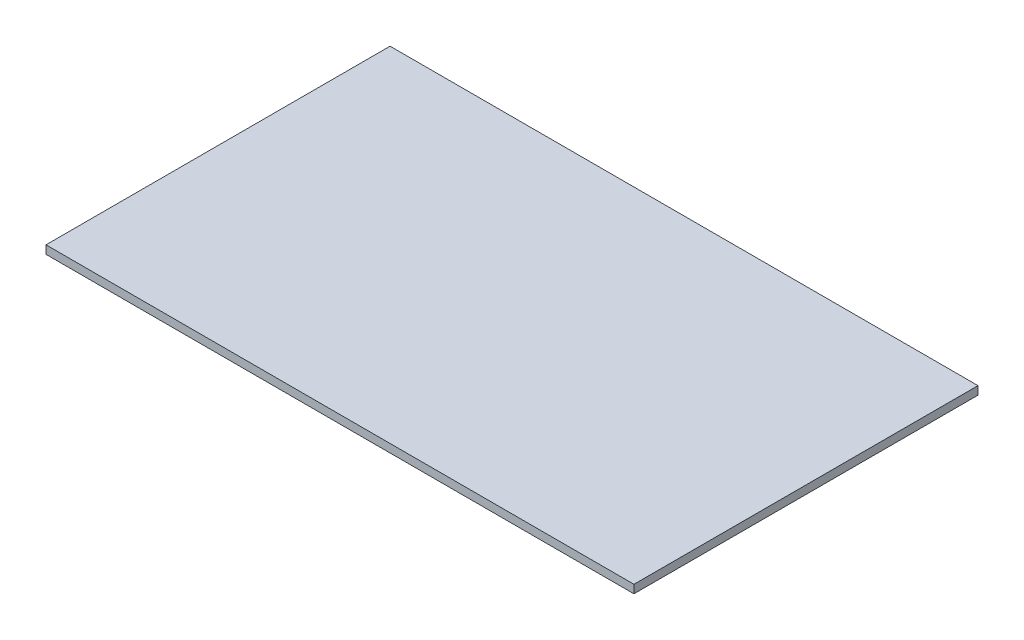
ISO-10303-21;
HEADER;
FILE_DESCRIPTION(('STEP AP214'),'2;1');
FILE_NAME('part.step','',(''),(''),'','','');
FILE_SCHEMA(('AUTOMOTIVE_DESIGN { 1 0 10303 214 1 1 1 1 }'));
ENDSEC;
DATA;
#1=APPLICATION_CONTEXT('core data for automotive mechanical design processes');
#2=APPLICATION_PROTOCOL_DEFINITION('international standard','automotive_design',2000,#1);
#3=PRODUCT_CONTEXT('',#1,'mechanical');
#4=PRODUCT('Part','Part','',(#3));
#5=PRODUCT_RELATED_PRODUCT_CATEGORY('part','',(#4));
#6=PRODUCT_DEFINITION_FORMATION('','',#4);
#7=PRODUCT_DEFINITION_CONTEXT('part definition',#1,'design');
#8=PRODUCT_DEFINITION('design','',#6,#7);
#9=PRODUCT_DEFINITION_SHAPE('','',#8);
#10=(LENGTH_UNIT() NAMED_UNIT(*) SI_UNIT(.MILLI.,.METRE.));
#11=(NAMED_UNIT(*) PLANE_ANGLE_UNIT() SI_UNIT($,.RADIAN.));
#12=(NAMED_UNIT(*) SI_UNIT($,.STERADIAN.) SOLID_ANGLE_UNIT());
#13=UNCERTAINTY_MEASURE_WITH_UNIT(LENGTH_MEASURE(1.E-05),#10,'distance_accuracy_value','');
#14=(GEOMETRIC_REPRESENTATION_CONTEXT(3) GLOBAL_UNCERTAINTY_ASSIGNED_CONTEXT((#13)) GLOBAL_UNIT_ASSIGNED_CONTEXT((#10,
#11,#12)) REPRESENTATION_CONTEXT('',''));
#15=CARTESIAN_POINT('',(0.,0.,0.));
#16=DIRECTION('',(0.,0.,1.));
#17=DIRECTION('',(1.,0.,0.));
#18=AXIS2_PLACEMENT_3D('',#15,#16,#17);
#19=CARTESIAN_POINT('',(0.,1.9,-69.));
#20=DIRECTION('',(0.,0.,1.));
#21=DIRECTION('',(1.,0.,0.));
#22=AXIS2_PLACEMENT_3D('',#19,#20,#21);
#23=PLANE('',#22);
#24=DIRECTION('',(-1.,0.,0.));
#25=VECTOR('',#24,1.);
#26=CARTESIAN_POINT('',(0.,1.9,-69.));
#27=LINE('',#26,#25);
#28=CARTESIAN_POINT('',(138.5,1.9,-69.));
#29=VERTEX_POINT('',#28);
#30=CARTESIAN_POINT('',(3.5,1.9,-69.));
#31=VERTEX_POINT('',#30);
#32=EDGE_CURVE('E11',#29,#31,#27,.T.);
#33=ORIENTED_EDGE('',*,*,#32,.F.);
#34=DIRECTION('',(0.,-1.,0.));
#35=VECTOR('',#34,1.);
#36=CARTESIAN_POINT('',(138.5,1.9,-69.));
#37=LINE('',#36,#35);
#38=CARTESIAN_POINT('',(138.5,0.,-69.));
#39=VERTEX_POINT('',#38);
#40=EDGE_CURVE('E84',#29,#39,#37,.T.);
#41=ORIENTED_EDGE('',*,*,#40,.T.);
#42=DIRECTION('',(-1.,0.,0.));
#43=VECTOR('',#42,1.);
#44=CARTESIAN_POINT('',(0.,0.,-69.));
#45=LINE('',#44,#43);
#46=CARTESIAN_POINT('',(3.5,0.,-69.));
#47=VERTEX_POINT('',#46);
#48=EDGE_CURVE('E40',#39,#47,#45,.T.);
#49=ORIENTED_EDGE('',*,*,#48,.T.);
#50=DIRECTION('',(0.,-1.,0.));
#51=VECTOR('',#50,1.);
#52=CARTESIAN_POINT('',(3.5,1.9,-69.));
#53=LINE('',#52,#51);
#54=EDGE_CURVE('E91',#31,#47,#53,.T.);
#55=ORIENTED_EDGE('',*,*,#54,.F.);
#56=EDGE_LOOP('',(#33,#41,#49,#55));
#57=FACE_BOUND('',#56,.T.);
#58=ADVANCED_FACE('F37',(#57),#23,.F.);
#59=CARTESIAN_POINT('',(0.,1.9,0.));
#60=DIRECTION('',(0.,-1.,0.));
#61=DIRECTION('',(0.,0.,-1.));
#62=AXIS2_PLACEMENT_3D('',#59,#60,#61);
#63=PLANE('',#62);
#64=DIRECTION('',(0.,0.,-1.));
#65=VECTOR('',#64,1.);
#66=CARTESIAN_POINT('',(138.5,1.9,0.));
#67=LINE('',#66,#65);
#68=CARTESIAN_POINT('',(138.5,1.9,10.));
#69=VERTEX_POINT('',#68);
#70=EDGE_CURVE('E73',#69,#29,#67,.T.);
#71=ORIENTED_EDGE('',*,*,#70,.T.);
#72=ORIENTED_EDGE('',*,*,#32,.T.);
#73=DIRECTION('',(0.,0.,1.));
#74=VECTOR('',#73,1.);
#75=CARTESIAN_POINT('',(3.5,1.9,0.));
#76=LINE('',#75,#74);
#77=CARTESIAN_POINT('',(3.5,1.9,10.));
#78=VERTEX_POINT('',#77);
#79=EDGE_CURVE('E90',#31,#78,#76,.T.);
#80=ORIENTED_EDGE('',*,*,#79,.T.);
#81=DIRECTION('',(1.,0.,0.));
#82=VECTOR('',#81,1.);
#83=CARTESIAN_POINT('',(3.5,1.9,10.));
#84=LINE('',#83,#82);
#85=EDGE_CURVE('E78',#78,#69,#84,.T.);
#86=ORIENTED_EDGE('',*,*,#85,.T.);
#87=EDGE_LOOP('',(#71,#72,#80,#86));
#88=FACE_BOUND('',#87,.T.);
#89=ADVANCED_FACE('F75',(#88),#63,.F.);
#90=CARTESIAN_POINT('',(0.,0.,0.));
#91=DIRECTION('',(0.,-1.,0.));
#92=DIRECTION('',(0.,0.,-1.));
#93=AXIS2_PLACEMENT_3D('',#90,#91,#92);
#94=PLANE('',#93);
#95=ORIENTED_EDGE('',*,*,#48,.F.);
#96=DIRECTION('',(0.,0.,-1.));
#97=VECTOR('',#96,1.);
#98=CARTESIAN_POINT('',(138.5,0.,0.));
#99=LINE('',#98,#97);
#100=CARTESIAN_POINT('',(138.5,0.,10.));
#101=VERTEX_POINT('',#100);
#102=EDGE_CURVE('E86',#101,#39,#99,.T.);
#103=ORIENTED_EDGE('',*,*,#102,.F.);
#104=DIRECTION('',(1.,0.,0.));
#105=VECTOR('',#104,1.);
#106=CARTESIAN_POINT('',(3.5,0.,10.));
#107=LINE('',#106,#105);
#108=CARTESIAN_POINT('',(3.5,0.,10.));
#109=VERTEX_POINT('',#108);
#110=EDGE_CURVE('E81',#109,#101,#107,.T.);
#111=ORIENTED_EDGE('',*,*,#110,.F.);
#112=DIRECTION('',(0.,0.,1.));
#113=VECTOR('',#112,1.);
#114=CARTESIAN_POINT('',(3.5,0.,0.));
#115=LINE('',#114,#113);
#116=EDGE_CURVE('E102',#47,#109,#115,.T.);
#117=ORIENTED_EDGE('',*,*,#116,.F.);
#118=EDGE_LOOP('',(#95,#103,#111,#117));
#119=FACE_BOUND('',#118,.T.);
#120=ADVANCED_FACE('F110',(#119),#94,.T.);
#121=CARTESIAN_POINT('',(3.5,-135.369863706809,10.));
#122=DIRECTION('',(0.,0.,1.));
#123=DIRECTION('',(1.,0.,0.));
#124=AXIS2_PLACEMENT_3D('',#121,#122,#123);
#125=PLANE('',#124);
#126=DIRECTION('',(0.,1.,0.));
#127=VECTOR('',#126,1.);
#128=CARTESIAN_POINT('',(3.5,-135.369863706809,10.));
#129=LINE('',#128,#127);
#130=EDGE_CURVE('E52',#109,#78,#129,.T.);
#131=ORIENTED_EDGE('',*,*,#130,.F.);
#132=ORIENTED_EDGE('',*,*,#110,.T.);
#133=DIRECTION('',(0.,1.,0.));
#134=VECTOR('',#133,1.);
#135=CARTESIAN_POINT('',(138.5,-135.369863706809,10.));
#136=LINE('',#135,#134);
#137=EDGE_CURVE('E101',#101,#69,#136,.T.);
#138=ORIENTED_EDGE('',*,*,#137,.T.);
#139=ORIENTED_EDGE('',*,*,#85,.F.);
#140=EDGE_LOOP('',(#131,#132,#138,#139));
#141=FACE_BOUND('',#140,.T.);
#142=ADVANCED_FACE('F107',(#141),#125,.T.);
#143=CARTESIAN_POINT('',(138.5,-135.369863706809,0.));
#144=DIRECTION('',(1.,0.,0.));
#145=DIRECTION('',(0.,0.,-1.));
#146=AXIS2_PLACEMENT_3D('',#143,#144,#145);
#147=PLANE('',#146);
#148=ORIENTED_EDGE('',*,*,#137,.F.);
#149=ORIENTED_EDGE('',*,*,#102,.T.);
#150=ORIENTED_EDGE('',*,*,#40,.F.);
#151=ORIENTED_EDGE('',*,*,#70,.F.);
#152=EDGE_LOOP('',(#148,#149,#150,#151));
#153=FACE_BOUND('',#152,.T.);
#154=ADVANCED_FACE('F85',(#153),#147,.T.);
#155=CARTESIAN_POINT('',(3.5,-135.369863706809,0.));
#156=DIRECTION('',(-1.,0.,0.));
#157=DIRECTION('',(0.,0.,1.));
#158=AXIS2_PLACEMENT_3D('',#155,#156,#157);
#159=PLANE('',#158);
#160=ORIENTED_EDGE('',*,*,#79,.F.);
#161=ORIENTED_EDGE('',*,*,#54,.T.);
#162=ORIENTED_EDGE('',*,*,#116,.T.);
#163=ORIENTED_EDGE('',*,*,#130,.T.);
#164=EDGE_LOOP('',(#160,#161,#162,#163));
#165=FACE_BOUND('',#164,.T.);
#166=ADVANCED_FACE('F111',(#165),#159,.T.);
#167=CLOSED_SHELL('',(#58,#89,#120,#142,#154,#166));
#168=MANIFOLD_SOLID_BREP('B2',#167);
#169=ADVANCED_BREP_SHAPE_REPRESENTATION('',(#18,#168),#14);
#170=SHAPE_DEFINITION_REPRESENTATION(#9,#169);
ENDSEC;
END-ISO-10303-21;
